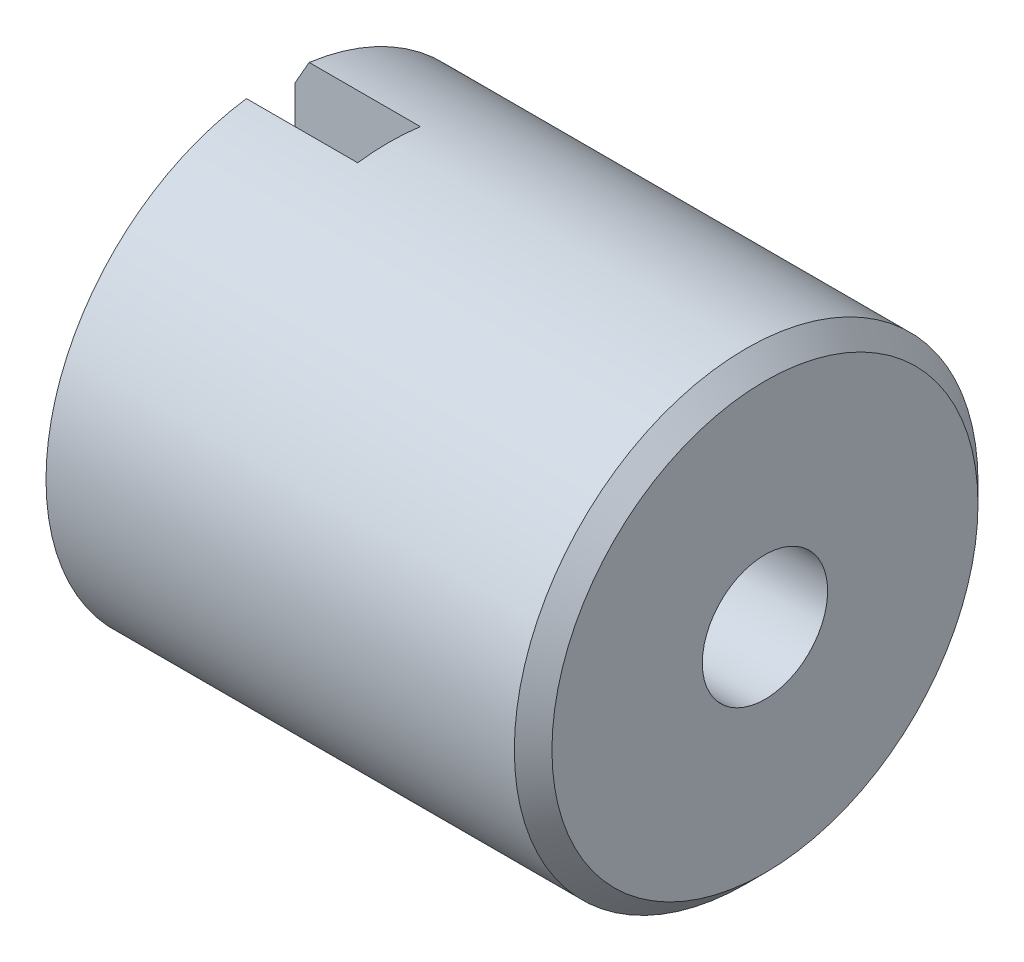
ISO-10303-21;
HEADER;
FILE_DESCRIPTION(('STEP AP214'),'2;1');
FILE_NAME('part.step','',(''),(''),'','','');
FILE_SCHEMA(('AUTOMOTIVE_DESIGN { 1 0 10303 214 1 1 1 1 }'));
ENDSEC;
DATA;
#1=APPLICATION_CONTEXT('core data for automotive mechanical design processes');
#2=APPLICATION_PROTOCOL_DEFINITION('international standard','automotive_design',2000,#1);
#3=PRODUCT_CONTEXT('',#1,'mechanical');
#4=PRODUCT('Part','Part','',(#3));
#5=PRODUCT_RELATED_PRODUCT_CATEGORY('part','',(#4));
#6=PRODUCT_DEFINITION_FORMATION('','',#4);
#7=PRODUCT_DEFINITION_CONTEXT('part definition',#1,'design');
#8=PRODUCT_DEFINITION('design','',#6,#7);
#9=PRODUCT_DEFINITION_SHAPE('','',#8);
#10=(LENGTH_UNIT() NAMED_UNIT(*) SI_UNIT(.MILLI.,.METRE.));
#11=(NAMED_UNIT(*) PLANE_ANGLE_UNIT() SI_UNIT($,.RADIAN.));
#12=(NAMED_UNIT(*) SI_UNIT($,.STERADIAN.) SOLID_ANGLE_UNIT());
#13=UNCERTAINTY_MEASURE_WITH_UNIT(LENGTH_MEASURE(1.E-05),#10,'distance_accuracy_value','');
#14=(GEOMETRIC_REPRESENTATION_CONTEXT(3) GLOBAL_UNCERTAINTY_ASSIGNED_CONTEXT((#13)) GLOBAL_UNIT_ASSIGNED_CONTEXT((#10,
#11,#12)) REPRESENTATION_CONTEXT('',''));
#15=CARTESIAN_POINT('',(0.,0.,0.));
#16=DIRECTION('',(0.,0.,1.));
#17=DIRECTION('',(1.,0.,0.));
#18=AXIS2_PLACEMENT_3D('',#15,#16,#17);
#19=CARTESIAN_POINT('',(0.398660360889445,0.,0.));
#20=DIRECTION('',(1.,0.,0.));
#21=DIRECTION('',(0.,0.,-1.));
#22=AXIS2_PLACEMENT_3D('',#19,#20,#21);
#23=CONICAL_SURFACE('',#22,4.00000000022737,1.04719755117612);
#24=CARTESIAN_POINT('',(1.3489090617961,5.62369540611742,-0.5));
#25=CARTESIAN_POINT('',(1.23385215596677,5.42361802622358,-0.5));
#26=CARTESIAN_POINT('',(1.11882582672862,5.22352304042469,-0.5));
#27=CARTESIAN_POINT('',(0.888878011197814,4.82327758121644,-0.5));
#28=CARTESIAN_POINT('',(0.773956523073983,4.62312710885903,-0.5));
#29=CARTESIAN_POINT('',(0.544265507572195,4.2227563999359,-0.5));
#30=CARTESIAN_POINT('',(0.42949597072478,4.02253616880479,-0.5));
#31=CARTESIAN_POINT('',(0.200179035688271,3.62196387492858,-0.5));
#32=CARTESIAN_POINT('',(0.0856316414210964,3.4216118099381,-0.5));
#33=CARTESIAN_POINT('',(-0.143114304489364,3.02067506698649,-0.5));
#34=CARTESIAN_POINT('',(-0.257312810613938,2.82009036301951,-0.5));
#35=CARTESIAN_POINT('',(-0.428100523720557,2.51893047521697,-0.5));
#36=CARTESIAN_POINT('',(-0.484943363908799,2.41849917743786,-0.5));
#37=CARTESIAN_POINT('',(-0.59838449331086,2.21749640053324,-0.5));
#38=CARTESIAN_POINT('',(-0.654982778766843,2.11692491928485,-0.5));
#39=CARTESIAN_POINT('',(-0.767822631206163,1.91556066376356,-0.5));
#40=CARTESIAN_POINT('',(-0.824064139322165,1.81476785648523,-0.5));
#41=CARTESIAN_POINT('',(-0.935970941302618,1.61286736073322,-0.5));
#42=CARTESIAN_POINT('',(-0.991636259682526,1.51175968589648,-0.5));
#43=CARTESIAN_POINT('',(-1.07439013200957,1.35967972721494,-0.5));
#44=CARTESIAN_POINT('',(-1.10185341927006,1.30891162231424,-0.499999999999999));
#45=CARTESIAN_POINT('',(-1.15643011170751,1.20718913776481,-0.499999999999999));
#46=CARTESIAN_POINT('',(-1.18354352519908,1.15623476257979,-0.499999999999999));
#47=CARTESIAN_POINT('',(-1.23729302629155,1.05406346360152,-0.499999999999999));
#48=CARTESIAN_POINT('',(-1.26392904024543,1.00284650084055,-0.499999999999999));
#49=CARTESIAN_POINT('',(-1.31645942186122,0.900029027932549,-0.499999999999999));
#50=CARTESIAN_POINT('',(-1.3423537273384,0.848428486080436,-0.499999999999999));
#51=CARTESIAN_POINT('',(-1.36774488772043,0.796576053406241,-0.499999999999999));
#52=B_SPLINE_CURVE_WITH_KNOTS('',3,(#24,#25,#26,#27,#28,#29,#30,#31,#32,#33,#34,#35,#36,#37,#38,
#39,#40,#41,#42,#43,#44,#45,#46,#47,#48,#49,#50,#51),.UNSPECIFIED.,.F.,.F.,(4,2,2,2,2,2,2,2,2,2,
2,2,2,4),(0.,0.692402686337558,1.38479303825913,2.07713799273797,2.76949506124652,
3.4619389010324,3.80814381531073,4.1543540305975,4.50061995671282,4.84687108899984,
5.02003092723685,5.19318664279255,5.36636884456586,5.53956552366454),.UNSPECIFIED.);
#53=CARTESIAN_POINT('',(0.225455279993093,3.66606055596467,-0.5));
#54=VERTEX_POINT('',#53);
#55=CARTESIAN_POINT('',(0.,3.27151192135387,-0.5));
#56=VERTEX_POINT('',#55);
#57=EDGE_CURVE('E124',#54,#56,#52,.T.);
#58=ORIENTED_EDGE('',*,*,#57,.F.);
#59=CARTESIAN_POINT('',(0.225455279993093,0.,0.));
#60=DIRECTION('',(1.,0.,0.));
#61=DIRECTION('',(0.,0.,-1.));
#62=AXIS2_PLACEMENT_3D('',#59,#60,#61);
#63=CIRCLE('',#62,3.7);
#64=CARTESIAN_POINT('',(0.225455279993093,3.66606055596467,0.5));
#65=VERTEX_POINT('',#64);
#66=EDGE_CURVE('E95',#54,#65,#63,.F.);
#67=ORIENTED_EDGE('',*,*,#66,.T.);
#68=CARTESIAN_POINT('',(-1.36774488772043,0.796576053406241,0.5));
#69=CARTESIAN_POINT('',(-1.34926933623304,0.834337144044935,0.5));
#70=CARTESIAN_POINT('',(-1.33051284082806,0.871958632236628,0.5));
#71=CARTESIAN_POINT('',(-1.29256252120345,0.946978234809909,0.5));
#72=CARTESIAN_POINT('',(-1.27336871967456,0.984376360654708,0.5));
#73=CARTESIAN_POINT('',(-1.21532003778455,1.09631604314223,0.5));
#74=CARTESIAN_POINT('',(-1.17599325054837,1.17061221334225,0.5));
#75=CARTESIAN_POINT('',(-1.09660376851453,1.31879108434093,0.5));
#76=CARTESIAN_POINT('',(-1.05654120540153,1.39267385609776,0.5));
#77=CARTESIAN_POINT('',(-0.97593411163335,1.54017947135059,0.5));
#78=CARTESIAN_POINT('',(-0.935389562017918,1.61380230447246,0.5));
#79=CARTESIAN_POINT('',(-0.823604431087833,1.81574859610531,0.5));
#80=CARTESIAN_POINT('',(-0.752036775976079,1.9438907513713,0.5));
#81=CARTESIAN_POINT('',(-0.608362519717563,2.1998727368458,0.5));
#82=CARTESIAN_POINT('',(-0.536255915391142,2.3277125652648,0.5));
#83=CARTESIAN_POINT('',(-0.319430211036031,2.71099151725757,0.5));
#84=CARTESIAN_POINT('',(-0.174224680039416,2.96615529660048,0.5));
#85=CARTESIAN_POINT('',(0.085652881706182,3.42164176553551,0.5));
#86=CARTESIAN_POINT('',(0.200216087409693,3.62202672798304,0.5));
#87=CARTESIAN_POINT('',(0.429569539364344,4.02266654812681,0.5));
#88=CARTESIAN_POINT('',(0.54435978543759,4.22292140592484,0.5));
#89=CARTESIAN_POINT('',(0.774053366042442,4.62329524241697,0.5));
#90=CARTESIAN_POINT('',(0.888956662264591,4.82341424310344,0.5));
#91=CARTESIAN_POINT('',(1.11886601481762,5.22359323109196,0.5));
#92=CARTESIAN_POINT('',(1.23387207115596,5.42365321838973,0.5));
#93=CARTESIAN_POINT('',(1.3489090617961,5.62369540611742,0.5));
#94=B_SPLINE_CURVE_WITH_KNOTS('',3,(#68,#69,#70,#71,#72,#73,#74,#75,#76,#77,#78,#79,#80,#81,#82,
#83,#84,#85,#86,#87,#88,#89,#90,#91,#92,#93),.UNSPECIFIED.,.F.,.F.,(4,2,2,2,2,2,2,2,2,2,2,2,4),
(0.,0.12611191069978,0.252217292598063,0.504396872716006,0.756531750811269,1.00867658035441,
1.44899314489204,1.88931230923566,2.77007027983864,3.46253674762147,4.15500267304853,
4.84728398192459,5.53956534106287),.UNSPECIFIED.);
#95=CARTESIAN_POINT('',(0.,3.27151192135387,0.5));
#96=VERTEX_POINT('',#95);
#97=EDGE_CURVE('E118',#96,#65,#94,.T.);
#98=ORIENTED_EDGE('',*,*,#97,.F.);
#99=CARTESIAN_POINT('',(0.,0.,0.));
#100=DIRECTION('',(-1.,0.,0.));
#101=DIRECTION('',(0.,0.,1.));
#102=AXIS2_PLACEMENT_3D('',#99,#100,#101);
#103=CIRCLE('',#102,3.30950000023576);
#104=EDGE_CURVE('E110',#56,#96,#103,.T.);
#105=ORIENTED_EDGE('',*,*,#104,.F.);
#106=EDGE_LOOP('',(#58,#67,#98,#105));
#107=FACE_BOUND('',#106,.T.);
#108=ADVANCED_FACE('F33',(#107),#23,.T.);
#109=CARTESIAN_POINT('',(0.,4.00000000022737,0.));
#110=DIRECTION('',(-1.,0.,0.));
#111=DIRECTION('',(0.,0.,1.));
#112=AXIS2_PLACEMENT_3D('',#109,#110,#111);
#113=PLANE('',#112);
#114=DIRECTION('',(0.,-1.,0.));
#115=VECTOR('',#114,1.);
#116=CARTESIAN_POINT('',(0.,4.41100356593834,-0.5));
#117=LINE('',#116,#115);
#118=CARTESIAN_POINT('',(0.,2.50049995001,-0.5));
#119=VERTEX_POINT('',#118);
#120=EDGE_CURVE('E152',#56,#119,#117,.T.);
#121=ORIENTED_EDGE('',*,*,#120,.F.);
#122=ORIENTED_EDGE('',*,*,#104,.T.);
#123=DIRECTION('',(0.,1.,0.));
#124=VECTOR('',#123,1.);
#125=CARTESIAN_POINT('',(0.,4.41100356593834,0.5));
#126=LINE('',#125,#124);
#127=CARTESIAN_POINT('',(0.,2.50049995001,0.5));
#128=VERTEX_POINT('',#127);
#129=EDGE_CURVE('E89',#128,#96,#126,.T.);
#130=ORIENTED_EDGE('',*,*,#129,.F.);
#131=CARTESIAN_POINT('',(0.,0.,0.));
#132=DIRECTION('',(-1.,0.,0.));
#133=DIRECTION('',(0.,0.,1.));
#134=AXIS2_PLACEMENT_3D('',#131,#132,#133);
#135=CIRCLE('',#134,2.55);
#136=EDGE_CURVE('E98',#119,#128,#135,.T.);
#137=ORIENTED_EDGE('',*,*,#136,.F.);
#138=EDGE_LOOP('',(#121,#122,#130,#137));
#139=FACE_BOUND('',#138,.T.);
#140=ADVANCED_FACE('F151',(#139),#113,.T.);
#141=CARTESIAN_POINT('',(2.2,0.,0.));
#142=DIRECTION('',(-1.,0.,0.));
#143=DIRECTION('',(0.,0.,1.));
#144=AXIS2_PLACEMENT_3D('',#141,#142,#143);
#145=CYLINDRICAL_SURFACE('',#144,2.55);
#146=CARTESIAN_POINT('',(2.2,0.,0.));
#147=DIRECTION('',(-1.,0.,0.));
#148=DIRECTION('',(0.,0.,1.));
#149=AXIS2_PLACEMENT_3D('',#146,#147,#148);
#150=CIRCLE('',#149,2.55);
#151=CARTESIAN_POINT('',(2.2,0.,2.55));
#152=VERTEX_POINT('',#151);
#153=EDGE_CURVE('E102',#152,#152,#150,.T.);
#154=ORIENTED_EDGE('',*,*,#153,.F.);
#155=EDGE_LOOP('',(#154));
#156=FACE_BOUND('',#155,.T.);
#157=CARTESIAN_POINT('',(2.,0.,0.));
#158=DIRECTION('',(-1.,0.,0.));
#159=DIRECTION('',(0.,0.,1.));
#160=AXIS2_PLACEMENT_3D('',#157,#158,#159);
#161=CIRCLE('',#160,2.55);
#162=CARTESIAN_POINT('',(2.,2.50049995001,-0.5));
#163=VERTEX_POINT('',#162);
#164=CARTESIAN_POINT('',(2.,2.50049995001,0.5));
#165=VERTEX_POINT('',#164);
#166=EDGE_CURVE('E122',#163,#165,#161,.F.);
#167=ORIENTED_EDGE('',*,*,#166,.F.);
#168=DIRECTION('',(-1.,0.,0.));
#169=VECTOR('',#168,1.);
#170=CARTESIAN_POINT('',(2.2,2.50049995001,-0.5));
#171=LINE('',#170,#169);
#172=EDGE_CURVE('E88',#163,#119,#171,.T.);
#173=ORIENTED_EDGE('',*,*,#172,.T.);
#174=ORIENTED_EDGE('',*,*,#136,.T.);
#175=DIRECTION('',(-1.,0.,0.));
#176=VECTOR('',#175,1.);
#177=CARTESIAN_POINT('',(2.2,2.50049995001,0.5));
#178=LINE('',#177,#176);
#179=EDGE_CURVE('E121',#128,#165,#178,.F.);
#180=ORIENTED_EDGE('',*,*,#179,.T.);
#181=EDGE_LOOP('',(#167,#173,#174,#180));
#182=FACE_BOUND('',#181,.T.);
#183=ADVANCED_FACE('F149',(#156,#182),#145,.F.);
#184=CARTESIAN_POINT('',(2.2,0.,0.));
#185=DIRECTION('',(-1.,0.,0.));
#186=DIRECTION('',(0.,0.,1.));
#187=AXIS2_PLACEMENT_3D('',#184,#185,#186);
#188=PLANE('',#187);
#189=CARTESIAN_POINT('',(2.2,0.,0.));
#190=DIRECTION('',(-1.,0.,0.));
#191=DIRECTION('',(0.,0.,1.));
#192=AXIS2_PLACEMENT_3D('',#189,#190,#191);
#193=CIRCLE('',#192,1.);
#194=CARTESIAN_POINT('',(2.2,0.,1.));
#195=VERTEX_POINT('',#194);
#196=EDGE_CURVE('E157',#195,#195,#193,.T.);
#197=ORIENTED_EDGE('',*,*,#196,.F.);
#198=EDGE_LOOP('',(#197));
#199=FACE_BOUND('',#198,.T.);
#200=ORIENTED_EDGE('',*,*,#153,.T.);
#201=EDGE_LOOP('',(#200));
#202=FACE_BOUND('',#201,.T.);
#203=ADVANCED_FACE('F171',(#199,#202),#188,.T.);
#204=CARTESIAN_POINT('',(8.,0.,0.));
#205=DIRECTION('',(-1.,0.,0.));
#206=DIRECTION('',(0.,0.,1.));
#207=AXIS2_PLACEMENT_3D('',#204,#205,#206);
#208=CYLINDRICAL_SURFACE('',#207,3.7);
#209=DIRECTION('',(-1.,0.,0.));
#210=VECTOR('',#209,1.);
#211=CARTESIAN_POINT('',(8.,3.66606055596467,-0.5));
#212=LINE('',#211,#210);
#213=CARTESIAN_POINT('',(2.,3.66606055596467,-0.5));
#214=VERTEX_POINT('',#213);
#215=EDGE_CURVE('E12',#214,#54,#212,.T.);
#216=ORIENTED_EDGE('',*,*,#215,.F.);
#217=CARTESIAN_POINT('',(2.,0.,0.));
#218=DIRECTION('',(-1.,0.,0.));
#219=DIRECTION('',(0.,0.,1.));
#220=AXIS2_PLACEMENT_3D('',#217,#218,#219);
#221=CIRCLE('',#220,3.7);
#222=CARTESIAN_POINT('',(2.,3.66606055596467,0.5));
#223=VERTEX_POINT('',#222);
#224=EDGE_CURVE('E78',#214,#223,#221,.F.);
#225=ORIENTED_EDGE('',*,*,#224,.T.);
#226=DIRECTION('',(-1.,0.,0.));
#227=VECTOR('',#226,1.);
#228=CARTESIAN_POINT('',(8.,3.66606055596467,0.5));
#229=LINE('',#228,#227);
#230=EDGE_CURVE('E41',#65,#223,#229,.F.);
#231=ORIENTED_EDGE('',*,*,#230,.F.);
#232=ORIENTED_EDGE('',*,*,#66,.F.);
#233=EDGE_LOOP('',(#216,#225,#231,#232));
#234=FACE_BOUND('',#233,.T.);
#235=CARTESIAN_POINT('',(7.70000000022738,0.,0.));
#236=DIRECTION('',(-1.,0.,0.));
#237=DIRECTION('',(0.,0.,1.));
#238=AXIS2_PLACEMENT_3D('',#235,#236,#237);
#239=CIRCLE('',#238,3.7);
#240=CARTESIAN_POINT('',(7.70000000022738,0.,3.7));
#241=VERTEX_POINT('',#240);
#242=EDGE_CURVE('E99',#241,#241,#239,.F.);
#243=ORIENTED_EDGE('',*,*,#242,.F.);
#244=EDGE_LOOP('',(#243));
#245=FACE_BOUND('',#244,.T.);
#246=ADVANCED_FACE('F92',(#234,#245),#208,.T.);
#247=CARTESIAN_POINT('',(8.,0.,0.));
#248=DIRECTION('',(-1.,0.,0.));
#249=DIRECTION('',(0.,0.,1.));
#250=AXIS2_PLACEMENT_3D('',#247,#248,#249);
#251=PLANE('',#250);
#252=CARTESIAN_POINT('',(8.,0.,0.));
#253=DIRECTION('',(-1.,0.,0.));
#254=DIRECTION('',(0.,0.,1.));
#255=AXIS2_PLACEMENT_3D('',#252,#253,#254);
#256=CIRCLE('',#255,1.);
#257=CARTESIAN_POINT('',(8.,0.,1.));
#258=VERTEX_POINT('',#257);
#259=EDGE_CURVE('E153',#258,#258,#256,.T.);
#260=ORIENTED_EDGE('',*,*,#259,.T.);
#261=EDGE_LOOP('',(#260));
#262=FACE_BOUND('',#261,.T.);
#263=CARTESIAN_POINT('',(8.,0.,0.));
#264=DIRECTION('',(-1.,0.,0.));
#265=DIRECTION('',(0.,0.,1.));
#266=AXIS2_PLACEMENT_3D('',#263,#264,#265);
#267=CIRCLE('',#266,3.40000000022738);
#268=CARTESIAN_POINT('',(8.,0.,3.40000000022738));
#269=VERTEX_POINT('',#268);
#270=EDGE_CURVE('E84',#269,#269,#267,.F.);
#271=ORIENTED_EDGE('',*,*,#270,.T.);
#272=EDGE_LOOP('',(#271));
#273=FACE_BOUND('',#272,.T.);
#274=ADVANCED_FACE('F163',(#262,#273),#251,.F.);
#275=CARTESIAN_POINT('',(7.4,0.,0.));
#276=DIRECTION('',(-1.,0.,0.));
#277=DIRECTION('',(0.,0.,1.));
#278=AXIS2_PLACEMENT_3D('',#275,#276,#277);
#279=CONICAL_SURFACE('',#278,4.00000000022737,0.785398163397448);
#280=ORIENTED_EDGE('',*,*,#270,.F.);
#281=EDGE_LOOP('',(#280));
#282=FACE_BOUND('',#281,.T.);
#283=ORIENTED_EDGE('',*,*,#242,.T.);
#284=EDGE_LOOP('',(#283));
#285=FACE_BOUND('',#284,.T.);
#286=ADVANCED_FACE('F35',(#282,#285),#279,.T.);
#287=CARTESIAN_POINT('',(2.,4.41100356593834,-0.5));
#288=DIRECTION('',(0.,0.,-1.));
#289=DIRECTION('',(0.,1.,0.));
#290=AXIS2_PLACEMENT_3D('',#287,#288,#289);
#291=PLANE('',#290);
#292=DIRECTION('',(0.,-1.,0.));
#293=VECTOR('',#292,1.);
#294=CARTESIAN_POINT('',(2.,4.41100356593834,-0.5));
#295=LINE('',#294,#293);
#296=EDGE_CURVE('E80',#214,#163,#295,.T.);
#297=ORIENTED_EDGE('',*,*,#296,.F.);
#298=ORIENTED_EDGE('',*,*,#215,.T.);
#299=ORIENTED_EDGE('',*,*,#57,.T.);
#300=ORIENTED_EDGE('',*,*,#120,.T.);
#301=ORIENTED_EDGE('',*,*,#172,.F.);
#302=EDGE_LOOP('',(#297,#298,#299,#300,#301));
#303=FACE_BOUND('',#302,.T.);
#304=ADVANCED_FACE('F86',(#303),#291,.F.);
#305=CARTESIAN_POINT('',(2.,4.41100356593834,0.5));
#306=DIRECTION('',(0.,0.,1.));
#307=DIRECTION('',(1.,0.,0.));
#308=AXIS2_PLACEMENT_3D('',#305,#306,#307);
#309=PLANE('',#308);
#310=ORIENTED_EDGE('',*,*,#129,.T.);
#311=ORIENTED_EDGE('',*,*,#97,.T.);
#312=ORIENTED_EDGE('',*,*,#230,.T.);
#313=DIRECTION('',(0.,1.,0.));
#314=VECTOR('',#313,1.);
#315=CARTESIAN_POINT('',(2.,4.41100356593834,0.5));
#316=LINE('',#315,#314);
#317=EDGE_CURVE('E48',#165,#223,#316,.T.);
#318=ORIENTED_EDGE('',*,*,#317,.F.);
#319=ORIENTED_EDGE('',*,*,#179,.F.);
#320=EDGE_LOOP('',(#310,#311,#312,#318,#319));
#321=FACE_BOUND('',#320,.T.);
#322=ADVANCED_FACE('F116',(#321),#309,.F.);
#323=CARTESIAN_POINT('',(2.,0.,0.));
#324=DIRECTION('',(-1.,0.,0.));
#325=DIRECTION('',(0.,0.,1.));
#326=AXIS2_PLACEMENT_3D('',#323,#324,#325);
#327=PLANE('',#326);
#328=ORIENTED_EDGE('',*,*,#166,.T.);
#329=ORIENTED_EDGE('',*,*,#317,.T.);
#330=ORIENTED_EDGE('',*,*,#224,.F.);
#331=ORIENTED_EDGE('',*,*,#296,.T.);
#332=EDGE_LOOP('',(#328,#329,#330,#331));
#333=FACE_BOUND('',#332,.T.);
#334=ADVANCED_FACE('F79',(#333),#327,.T.);
#335=CARTESIAN_POINT('',(8.,0.,0.));
#336=DIRECTION('',(-1.,0.,0.));
#337=DIRECTION('',(0.,0.,1.));
#338=AXIS2_PLACEMENT_3D('',#335,#336,#337);
#339=CYLINDRICAL_SURFACE('',#338,1.);
#340=ORIENTED_EDGE('',*,*,#259,.F.);
#341=EDGE_LOOP('',(#340));
#342=FACE_BOUND('',#341,.T.);
#343=ORIENTED_EDGE('',*,*,#196,.T.);
#344=EDGE_LOOP('',(#343));
#345=FACE_BOUND('',#344,.T.);
#346=ADVANCED_FACE('F166',(#342,#345),#339,.F.);
#347=CLOSED_SHELL('',(#108,#140,#183,#203,#246,#274,#286,#304,#322,#334,#346));
#348=MANIFOLD_SOLID_BREP('B2',#347);
#349=ADVANCED_BREP_SHAPE_REPRESENTATION('',(#18,#348),#14);
#350=SHAPE_DEFINITION_REPRESENTATION(#9,#349);
ENDSEC;
END-ISO-10303-21;
